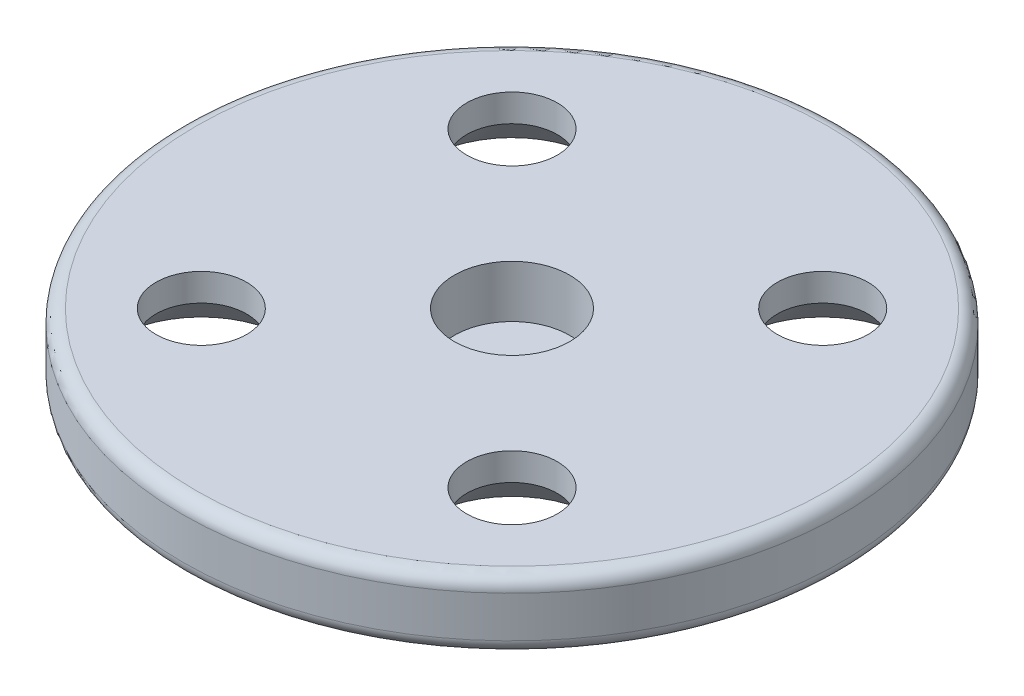
ISO-10303-21;
HEADER;
FILE_DESCRIPTION(('STEP AP214'),'2;1');
FILE_NAME('part.step','',(''),(''),'','','');
FILE_SCHEMA(('AUTOMOTIVE_DESIGN { 1 0 10303 214 1 1 1 1 }'));
ENDSEC;
DATA;
#1=APPLICATION_CONTEXT('core data for automotive mechanical design processes');
#2=APPLICATION_PROTOCOL_DEFINITION('international standard','automotive_design',2000,#1);
#3=PRODUCT_CONTEXT('',#1,'mechanical');
#4=PRODUCT('Part','Part','',(#3));
#5=PRODUCT_RELATED_PRODUCT_CATEGORY('part','',(#4));
#6=PRODUCT_DEFINITION_FORMATION('','',#4);
#7=PRODUCT_DEFINITION_CONTEXT('part definition',#1,'design');
#8=PRODUCT_DEFINITION('design','',#6,#7);
#9=PRODUCT_DEFINITION_SHAPE('','',#8);
#10=(LENGTH_UNIT() NAMED_UNIT(*) SI_UNIT(.MILLI.,.METRE.));
#11=(NAMED_UNIT(*) PLANE_ANGLE_UNIT() SI_UNIT($,.RADIAN.));
#12=(NAMED_UNIT(*) SI_UNIT($,.STERADIAN.) SOLID_ANGLE_UNIT());
#13=UNCERTAINTY_MEASURE_WITH_UNIT(LENGTH_MEASURE(1.E-05),#10,'distance_accuracy_value','');
#14=(GEOMETRIC_REPRESENTATION_CONTEXT(3) GLOBAL_UNCERTAINTY_ASSIGNED_CONTEXT((#13)) GLOBAL_UNIT_ASSIGNED_CONTEXT((#10,
#11,#12)) REPRESENTATION_CONTEXT('',''));
#15=CARTESIAN_POINT('',(0.,0.,0.));
#16=DIRECTION('',(0.,0.,1.));
#17=DIRECTION('',(1.,0.,0.));
#18=AXIS2_PLACEMENT_3D('',#15,#16,#17);
#19=CARTESIAN_POINT('',(0.,2.5,0.));
#20=DIRECTION('',(0.,1.,0.));
#21=DIRECTION('',(0.,0.,1.));
#22=AXIS2_PLACEMENT_3D('',#19,#20,#21);
#23=PLANE('',#22);
#24=CARTESIAN_POINT('',(0.,2.5,0.));
#25=DIRECTION('',(0.,1.,0.));
#26=DIRECTION('',(0.,0.,1.));
#27=AXIS2_PLACEMENT_3D('',#24,#25,#26);
#28=CIRCLE('',#27,11.5);
#29=CARTESIAN_POINT('',(0.,2.5,11.5));
#30=VERTEX_POINT('',#29);
#31=EDGE_CURVE('E10',#30,#30,#28,.T.);
#32=ORIENTED_EDGE('',*,*,#31,.T.);
#33=EDGE_LOOP('',(#32));
#34=FACE_BOUND('',#33,.T.);
#35=CARTESIAN_POINT('',(0.,2.5,0.));
#36=DIRECTION('',(0.,1.,0.));
#37=DIRECTION('',(0.,0.,1.));
#38=AXIS2_PLACEMENT_3D('',#35,#36,#37);
#39=CIRCLE('',#38,2.1);
#40=CARTESIAN_POINT('',(0.,2.5,2.1));
#41=VERTEX_POINT('',#40);
#42=EDGE_CURVE('E115',#41,#41,#39,.T.);
#43=ORIENTED_EDGE('',*,*,#42,.F.);
#44=EDGE_LOOP('',(#43));
#45=FACE_BOUND('',#44,.T.);
#46=CARTESIAN_POINT('',(5.65685424949238,2.5,5.65685424949238));
#47=DIRECTION('',(0.,1.,0.));
#48=DIRECTION('',(0.,0.,1.));
#49=AXIS2_PLACEMENT_3D('',#46,#47,#48);
#50=CIRCLE('',#49,1.65);
#51=CARTESIAN_POINT('',(5.65685424949238,2.5,7.30685424949238));
#52=VERTEX_POINT('',#51);
#53=EDGE_CURVE('E106',#52,#52,#50,.T.);
#54=ORIENTED_EDGE('',*,*,#53,.F.);
#55=EDGE_LOOP('',(#54));
#56=FACE_BOUND('',#55,.T.);
#57=CARTESIAN_POINT('',(-5.65685424949238,2.5,-5.65685424949238));
#58=DIRECTION('',(0.,1.,0.));
#59=DIRECTION('',(0.,0.,1.));
#60=AXIS2_PLACEMENT_3D('',#57,#58,#59);
#61=CIRCLE('',#60,1.65);
#62=CARTESIAN_POINT('',(-5.65685424949238,2.5,-4.00685424949238));
#63=VERTEX_POINT('',#62);
#64=EDGE_CURVE('E98',#63,#63,#61,.T.);
#65=ORIENTED_EDGE('',*,*,#64,.F.);
#66=EDGE_LOOP('',(#65));
#67=FACE_BOUND('',#66,.T.);
#68=CARTESIAN_POINT('',(5.65685424949238,2.5,-5.65685424949238));
#69=DIRECTION('',(0.,1.,0.));
#70=DIRECTION('',(0.,0.,1.));
#71=AXIS2_PLACEMENT_3D('',#68,#69,#70);
#72=CIRCLE('',#71,1.65);
#73=CARTESIAN_POINT('',(5.65685424949238,2.5,-4.00685424949238));
#74=VERTEX_POINT('',#73);
#75=EDGE_CURVE('E102',#74,#74,#72,.T.);
#76=ORIENTED_EDGE('',*,*,#75,.F.);
#77=EDGE_LOOP('',(#76));
#78=FACE_BOUND('',#77,.T.);
#79=CARTESIAN_POINT('',(-5.65685424949238,2.5,5.65685424949238));
#80=DIRECTION('',(0.,1.,0.));
#81=DIRECTION('',(0.,0.,1.));
#82=AXIS2_PLACEMENT_3D('',#79,#80,#81);
#83=CIRCLE('',#82,1.65);
#84=CARTESIAN_POINT('',(-5.65685424949238,2.5,7.30685424949238));
#85=VERTEX_POINT('',#84);
#86=EDGE_CURVE('E110',#85,#85,#83,.T.);
#87=ORIENTED_EDGE('',*,*,#86,.F.);
#88=EDGE_LOOP('',(#87));
#89=FACE_BOUND('',#88,.T.);
#90=ADVANCED_FACE('F42',(#34,#45,#56,#67,#78,#89),#23,.T.);
#91=CARTESIAN_POINT('',(0.,0.,0.));
#92=DIRECTION('',(0.,1.,0.));
#93=DIRECTION('',(0.,0.,1.));
#94=AXIS2_PLACEMENT_3D('',#91,#92,#93);
#95=PLANE('',#94);
#96=CARTESIAN_POINT('',(0.,0.,0.));
#97=DIRECTION('',(0.,1.,0.));
#98=DIRECTION('',(0.,0.,1.));
#99=AXIS2_PLACEMENT_3D('',#96,#97,#98);
#100=CIRCLE('',#99,11.5);
#101=CARTESIAN_POINT('',(0.,0.,11.5));
#102=VERTEX_POINT('',#101);
#103=EDGE_CURVE('E50',#102,#102,#100,.F.);
#104=ORIENTED_EDGE('',*,*,#103,.T.);
#105=EDGE_LOOP('',(#104));
#106=FACE_BOUND('',#105,.T.);
#107=CARTESIAN_POINT('',(5.65685424949238,0.,-5.65685424949238));
#108=DIRECTION('',(0.,1.,0.));
#109=DIRECTION('',(0.,0.,1.));
#110=AXIS2_PLACEMENT_3D('',#107,#108,#109);
#111=CIRCLE('',#110,3.15);
#112=CARTESIAN_POINT('',(5.65685424949238,0.,-2.50685424949238));
#113=VERTEX_POINT('',#112);
#114=EDGE_CURVE('E82',#113,#113,#111,.T.);
#115=ORIENTED_EDGE('',*,*,#114,.T.);
#116=EDGE_LOOP('',(#115));
#117=FACE_BOUND('',#116,.T.);
#118=CARTESIAN_POINT('',(5.65685424949238,0.,5.65685424949238));
#119=DIRECTION('',(0.,1.,0.));
#120=DIRECTION('',(0.,0.,1.));
#121=AXIS2_PLACEMENT_3D('',#118,#119,#120);
#122=CIRCLE('',#121,3.15);
#123=CARTESIAN_POINT('',(5.65685424949238,0.,8.80685424949238));
#124=VERTEX_POINT('',#123);
#125=EDGE_CURVE('E86',#124,#124,#122,.T.);
#126=ORIENTED_EDGE('',*,*,#125,.T.);
#127=EDGE_LOOP('',(#126));
#128=FACE_BOUND('',#127,.T.);
#129=CARTESIAN_POINT('',(-5.65685424949238,0.,-5.65685424949238));
#130=DIRECTION('',(0.,1.,0.));
#131=DIRECTION('',(0.,0.,1.));
#132=AXIS2_PLACEMENT_3D('',#129,#130,#131);
#133=CIRCLE('',#132,3.15);
#134=CARTESIAN_POINT('',(-5.65685424949238,0.,-2.50685424949238));
#135=VERTEX_POINT('',#134);
#136=EDGE_CURVE('E90',#135,#135,#133,.T.);
#137=ORIENTED_EDGE('',*,*,#136,.T.);
#138=EDGE_LOOP('',(#137));
#139=FACE_BOUND('',#138,.T.);
#140=CARTESIAN_POINT('',(-5.65685424949238,0.,5.65685424949238));
#141=DIRECTION('',(0.,1.,0.));
#142=DIRECTION('',(0.,0.,1.));
#143=AXIS2_PLACEMENT_3D('',#140,#141,#142);
#144=CIRCLE('',#143,3.15);
#145=CARTESIAN_POINT('',(-5.65685424949238,0.,8.80685424949238));
#146=VERTEX_POINT('',#145);
#147=EDGE_CURVE('E94',#146,#146,#144,.T.);
#148=ORIENTED_EDGE('',*,*,#147,.T.);
#149=EDGE_LOOP('',(#148));
#150=FACE_BOUND('',#149,.T.);
#151=ADVANCED_FACE('F134',(#106,#117,#128,#139,#150),#95,.F.);
#152=CARTESIAN_POINT('',(0.,2.5,0.));
#153=DIRECTION('',(0.,-1.,0.));
#154=DIRECTION('',(0.,0.,-1.));
#155=AXIS2_PLACEMENT_3D('',#152,#153,#154);
#156=CYLINDRICAL_SURFACE('',#155,12.);
#157=CARTESIAN_POINT('',(0.,0.5,0.));
#158=DIRECTION('',(0.,1.,0.));
#159=DIRECTION('',(0.,0.,1.));
#160=AXIS2_PLACEMENT_3D('',#157,#158,#159);
#161=CIRCLE('',#160,12.);
#162=CARTESIAN_POINT('',(0.,0.5,12.));
#163=VERTEX_POINT('',#162);
#164=EDGE_CURVE('E55',#163,#163,#161,.T.);
#165=ORIENTED_EDGE('',*,*,#164,.T.);
#166=EDGE_LOOP('',(#165));
#167=FACE_BOUND('',#166,.T.);
#168=CARTESIAN_POINT('',(0.,2.,0.));
#169=DIRECTION('',(0.,1.,0.));
#170=DIRECTION('',(0.,0.,1.));
#171=AXIS2_PLACEMENT_3D('',#168,#169,#170);
#172=CIRCLE('',#171,12.);
#173=CARTESIAN_POINT('',(0.,2.,12.));
#174=VERTEX_POINT('',#173);
#175=EDGE_CURVE('E60',#174,#174,#172,.F.);
#176=ORIENTED_EDGE('',*,*,#175,.T.);
#177=EDGE_LOOP('',(#176));
#178=FACE_BOUND('',#177,.T.);
#179=ADVANCED_FACE('F161',(#167,#178),#156,.T.);
#180=CARTESIAN_POINT('',(-5.65685424949238,2.5,-5.65685424949238));
#181=DIRECTION('',(0.,-1.,0.));
#182=DIRECTION('',(0.,0.,-1.));
#183=AXIS2_PLACEMENT_3D('',#180,#181,#182);
#184=CYLINDRICAL_SURFACE('',#183,1.65);
#185=CARTESIAN_POINT('',(-5.65685424949238,1.50000000000001,-5.65685424949238));
#186=DIRECTION('',(0.,1.,0.));
#187=DIRECTION('',(0.,0.,1.));
#188=AXIS2_PLACEMENT_3D('',#185,#186,#187);
#189=CIRCLE('',#188,1.65);
#190=CARTESIAN_POINT('',(-5.65685424949238,1.50000000000001,-4.00685424949238));
#191=VERTEX_POINT('',#190);
#192=EDGE_CURVE('E70',#191,#191,#189,.F.);
#193=ORIENTED_EDGE('',*,*,#192,.T.);
#194=EDGE_LOOP('',(#193));
#195=FACE_BOUND('',#194,.T.);
#196=ORIENTED_EDGE('',*,*,#64,.T.);
#197=EDGE_LOOP('',(#196));
#198=FACE_BOUND('',#197,.T.);
#199=ADVANCED_FACE('F158',(#195,#198),#184,.F.);
#200=CARTESIAN_POINT('',(5.65685424949238,2.5,-5.65685424949238));
#201=DIRECTION('',(0.,-1.,0.));
#202=DIRECTION('',(0.,0.,-1.));
#203=AXIS2_PLACEMENT_3D('',#200,#201,#202);
#204=CYLINDRICAL_SURFACE('',#203,1.65);
#205=CARTESIAN_POINT('',(5.65685424949238,1.50000000000001,-5.65685424949238));
#206=DIRECTION('',(0.,1.,0.));
#207=DIRECTION('',(0.,0.,1.));
#208=AXIS2_PLACEMENT_3D('',#205,#206,#207);
#209=CIRCLE('',#208,1.65);
#210=CARTESIAN_POINT('',(5.65685424949238,1.50000000000001,-4.00685424949238));
#211=VERTEX_POINT('',#210);
#212=EDGE_CURVE('E78',#211,#211,#209,.F.);
#213=ORIENTED_EDGE('',*,*,#212,.T.);
#214=EDGE_LOOP('',(#213));
#215=FACE_BOUND('',#214,.T.);
#216=ORIENTED_EDGE('',*,*,#75,.T.);
#217=EDGE_LOOP('',(#216));
#218=FACE_BOUND('',#217,.T.);
#219=ADVANCED_FACE('F151',(#215,#218),#204,.F.);
#220=CARTESIAN_POINT('',(5.65685424949238,2.5,5.65685424949238));
#221=DIRECTION('',(0.,-1.,0.));
#222=DIRECTION('',(0.,0.,-1.));
#223=AXIS2_PLACEMENT_3D('',#220,#221,#222);
#224=CYLINDRICAL_SURFACE('',#223,1.65);
#225=CARTESIAN_POINT('',(5.65685424949238,1.50000000000001,5.65685424949238));
#226=DIRECTION('',(0.,1.,0.));
#227=DIRECTION('',(0.,0.,1.));
#228=AXIS2_PLACEMENT_3D('',#225,#226,#227);
#229=CIRCLE('',#228,1.65);
#230=CARTESIAN_POINT('',(5.65685424949238,1.50000000000001,7.30685424949238));
#231=VERTEX_POINT('',#230);
#232=EDGE_CURVE('E74',#231,#231,#229,.F.);
#233=ORIENTED_EDGE('',*,*,#232,.T.);
#234=EDGE_LOOP('',(#233));
#235=FACE_BOUND('',#234,.T.);
#236=ORIENTED_EDGE('',*,*,#53,.T.);
#237=EDGE_LOOP('',(#236));
#238=FACE_BOUND('',#237,.T.);
#239=ADVANCED_FACE('F145',(#235,#238),#224,.F.);
#240=CARTESIAN_POINT('',(-5.65685424949238,2.5,5.65685424949238));
#241=DIRECTION('',(0.,-1.,0.));
#242=DIRECTION('',(0.,0.,-1.));
#243=AXIS2_PLACEMENT_3D('',#240,#241,#242);
#244=CYLINDRICAL_SURFACE('',#243,1.65);
#245=CARTESIAN_POINT('',(-5.65685424949238,1.50000000000001,5.65685424949238));
#246=DIRECTION('',(0.,1.,0.));
#247=DIRECTION('',(0.,0.,1.));
#248=AXIS2_PLACEMENT_3D('',#245,#246,#247);
#249=CIRCLE('',#248,1.65);
#250=CARTESIAN_POINT('',(-5.65685424949238,1.50000000000001,7.30685424949238));
#251=VERTEX_POINT('',#250);
#252=EDGE_CURVE('E66',#251,#251,#249,.F.);
#253=ORIENTED_EDGE('',*,*,#252,.T.);
#254=EDGE_LOOP('',(#253));
#255=FACE_BOUND('',#254,.T.);
#256=ORIENTED_EDGE('',*,*,#86,.T.);
#257=EDGE_LOOP('',(#256));
#258=FACE_BOUND('',#257,.T.);
#259=ADVANCED_FACE('F128',(#255,#258),#244,.F.);
#260=CARTESIAN_POINT('',(0.,0.6,0.));
#261=DIRECTION('',(0.,1.,0.));
#262=DIRECTION('',(0.,0.,1.));
#263=AXIS2_PLACEMENT_3D('',#260,#261,#262);
#264=CYLINDRICAL_SURFACE('',#263,2.1);
#265=CARTESIAN_POINT('',(0.,0.6,0.));
#266=DIRECTION('',(0.,1.,0.));
#267=DIRECTION('',(0.,0.,1.));
#268=AXIS2_PLACEMENT_3D('',#265,#266,#267);
#269=CIRCLE('',#268,2.1);
#270=CARTESIAN_POINT('',(0.,0.6,2.1));
#271=VERTEX_POINT('',#270);
#272=EDGE_CURVE('E114',#271,#271,#269,.T.);
#273=CARTESIAN_POINT('',(0.,0.6,2.1));
#274=CARTESIAN_POINT('',(0.,0.619791666666667,2.1));
#275=CARTESIAN_POINT('',(0.,0.639583333333333,2.1));
#276=CARTESIAN_POINT('',(0.,0.679166666666667,2.1));
#277=CARTESIAN_POINT('',(0.,0.698958333333333,2.1));
#278=CARTESIAN_POINT('',(0.,0.738541666666667,2.1));
#279=CARTESIAN_POINT('',(0.,0.758333333333333,2.1));
#280=CARTESIAN_POINT('',(0.,0.797916666666667,2.1));
#281=CARTESIAN_POINT('',(0.,0.817708333333333,2.1));
#282=CARTESIAN_POINT('',(0.,0.857291666666667,2.1));
#283=CARTESIAN_POINT('',(0.,0.877083333333333,2.1));
#284=CARTESIAN_POINT('',(0.,0.916666666666667,2.1));
#285=CARTESIAN_POINT('',(0.,0.936458333333333,2.1));
#286=CARTESIAN_POINT('',(0.,0.976041666666667,2.1));
#287=CARTESIAN_POINT('',(0.,0.995833333333333,2.1));
#288=CARTESIAN_POINT('',(0.,1.03541666666667,2.1));
#289=CARTESIAN_POINT('',(0.,1.05520833333333,2.1));
#290=CARTESIAN_POINT('',(0.,1.09479166666667,2.1));
#291=CARTESIAN_POINT('',(0.,1.11458333333333,2.1));
#292=CARTESIAN_POINT('',(0.,1.15416666666667,2.1));
#293=CARTESIAN_POINT('',(0.,1.17395833333333,2.1));
#294=CARTESIAN_POINT('',(0.,1.21354166666667,2.1));
#295=CARTESIAN_POINT('',(0.,1.23333333333333,2.1));
#296=CARTESIAN_POINT('',(0.,1.27291666666667,2.1));
#297=CARTESIAN_POINT('',(0.,1.29270833333333,2.1));
#298=CARTESIAN_POINT('',(0.,1.33229166666667,2.1));
#299=CARTESIAN_POINT('',(0.,1.35208333333333,2.1));
#300=CARTESIAN_POINT('',(0.,1.39166666666667,2.1));
#301=CARTESIAN_POINT('',(0.,1.41145833333333,2.1));
#302=CARTESIAN_POINT('',(0.,1.45104166666667,2.1));
#303=CARTESIAN_POINT('',(0.,1.47083333333333,2.1));
#304=CARTESIAN_POINT('',(0.,1.51041666666667,2.1));
#305=CARTESIAN_POINT('',(0.,1.53020833333333,2.1));
#306=CARTESIAN_POINT('',(0.,1.56979166666667,2.1));
#307=CARTESIAN_POINT('',(0.,1.58958333333333,2.1));
#308=CARTESIAN_POINT('',(0.,1.62916666666667,2.1));
#309=CARTESIAN_POINT('',(0.,1.64895833333333,2.1));
#310=CARTESIAN_POINT('',(0.,1.68854166666667,2.1));
#311=CARTESIAN_POINT('',(0.,1.70833333333333,2.1));
#312=CARTESIAN_POINT('',(0.,1.74791666666667,2.1));
#313=CARTESIAN_POINT('',(0.,1.76770833333333,2.1));
#314=CARTESIAN_POINT('',(0.,1.80729166666667,2.1));
#315=CARTESIAN_POINT('',(0.,1.82708333333333,2.1));
#316=CARTESIAN_POINT('',(0.,1.86666666666667,2.1));
#317=CARTESIAN_POINT('',(0.,1.88645833333333,2.1));
#318=CARTESIAN_POINT('',(0.,1.92604166666667,2.1));
#319=CARTESIAN_POINT('',(0.,1.94583333333333,2.1));
#320=CARTESIAN_POINT('',(0.,1.98541666666667,2.1));
#321=CARTESIAN_POINT('',(0.,2.00520833333333,2.1));
#322=CARTESIAN_POINT('',(0.,2.04479166666667,2.1));
#323=CARTESIAN_POINT('',(0.,2.06458333333333,2.1));
#324=CARTESIAN_POINT('',(0.,2.10416666666667,2.1));
#325=CARTESIAN_POINT('',(0.,2.12395833333333,2.1));
#326=CARTESIAN_POINT('',(0.,2.16354166666667,2.1));
#327=CARTESIAN_POINT('',(0.,2.18333333333333,2.1));
#328=CARTESIAN_POINT('',(0.,2.22291666666667,2.1));
#329=CARTESIAN_POINT('',(0.,2.24270833333333,2.1));
#330=CARTESIAN_POINT('',(0.,2.28229166666667,2.1));
#331=CARTESIAN_POINT('',(0.,2.30208333333333,2.1));
#332=CARTESIAN_POINT('',(0.,2.34166666666667,2.1));
#333=CARTESIAN_POINT('',(0.,2.36145833333333,2.1));
#334=CARTESIAN_POINT('',(0.,2.40104166666667,2.1));
#335=CARTESIAN_POINT('',(0.,2.42083333333333,2.1));
#336=CARTESIAN_POINT('',(0.,2.46041666666667,2.1));
#337=CARTESIAN_POINT('',(0.,2.48020833333333,2.1));
#338=CARTESIAN_POINT('',(0.,2.5,2.1));
#339=B_SPLINE_CURVE_WITH_KNOTS('',3,(#273,#274,#275,#276,#277,#278,#279,#280,#281,#282,#283,
#284,#285,#286,#287,#288,#289,#290,#291,#292,#293,#294,#295,#296,#297,#298,#299,#300,#301,#302,
#303,#304,#305,#306,#307,#308,#309,#310,#311,#312,#313,#314,#315,#316,#317,#318,#319,#320,#321,
#322,#323,#324,#325,#326,#327,#328,#329,#330,#331,#332,#333,#334,#335,#336,#337,#338),
.UNSPECIFIED.,.F.,.F.,(4,2,2,2,2,2,2,2,2,2,2,2,2,2,2,2,2,2,2,2,2,2,2,2,2,2,2,2,2,2,2,2,4),(0.,
0.0593750000000001,0.11875,0.178125,0.2375,0.296875,0.35625,0.415625,0.475,0.534375,0.59375,
0.653125,0.7125,0.771875,0.83125,0.890625,0.95,1.009375,1.06875,1.128125,1.1875,1.246875,
1.30625,1.365625,1.425,1.484375,1.54375,1.603125,1.6625,1.721875,1.78125,1.840625,1.9),.UNSPECIFIED.);
#340=EDGE_CURVE('BSEAM125',#271,#41,#339,.T.);
#341=ORIENTED_EDGE('',*,*,#272,.F.);
#342=ORIENTED_EDGE('',*,*,#42,.T.);
#343=ORIENTED_EDGE('',*,*,#340,.T.);
#344=ORIENTED_EDGE('',*,*,#340,.F.);
#345=EDGE_LOOP('',(#341,#343,#342,#344));
#346=FACE_BOUND('',#345,.T.);
#347=ADVANCED_FACE('F125',(#346),#264,.F.);
#348=CARTESIAN_POINT('',(0.,0.6,0.));
#349=DIRECTION('',(0.,1.,0.));
#350=DIRECTION('',(0.,0.,1.));
#351=AXIS2_PLACEMENT_3D('',#348,#349,#350);
#352=PLANE('',#351);
#353=ORIENTED_EDGE('',*,*,#272,.T.);
#354=EDGE_LOOP('',(#353));
#355=FACE_BOUND('',#354,.T.);
#356=ADVANCED_FACE('F123',(#355),#352,.T.);
#357=CARTESIAN_POINT('',(5.65685424949238,0.,-5.65685424949238));
#358=DIRECTION('',(0.,-1.,0.));
#359=DIRECTION('',(0.,0.,-1.));
#360=AXIS2_PLACEMENT_3D('',#357,#358,#359);
#361=CONICAL_SURFACE('',#360,3.15,0.785398163397447);
#362=ORIENTED_EDGE('',*,*,#212,.F.);
#363=EDGE_LOOP('',(#362));
#364=FACE_BOUND('',#363,.T.);
#365=ORIENTED_EDGE('',*,*,#114,.F.);
#366=EDGE_LOOP('',(#365));
#367=FACE_BOUND('',#366,.T.);
#368=ADVANCED_FACE('F170',(#364,#367),#361,.F.);
#369=CARTESIAN_POINT('',(5.65685424949238,0.,5.65685424949238));
#370=DIRECTION('',(0.,-1.,0.));
#371=DIRECTION('',(0.,0.,-1.));
#372=AXIS2_PLACEMENT_3D('',#369,#370,#371);
#373=CONICAL_SURFACE('',#372,3.15,0.785398163397447);
#374=ORIENTED_EDGE('',*,*,#232,.F.);
#375=EDGE_LOOP('',(#374));
#376=FACE_BOUND('',#375,.T.);
#377=ORIENTED_EDGE('',*,*,#125,.F.);
#378=EDGE_LOOP('',(#377));
#379=FACE_BOUND('',#378,.T.);
#380=ADVANCED_FACE('F176',(#376,#379),#373,.F.);
#381=CARTESIAN_POINT('',(-5.65685424949238,0.,-5.65685424949238));
#382=DIRECTION('',(0.,-1.,0.));
#383=DIRECTION('',(0.,0.,-1.));
#384=AXIS2_PLACEMENT_3D('',#381,#382,#383);
#385=CONICAL_SURFACE('',#384,3.15,0.785398163397447);
#386=ORIENTED_EDGE('',*,*,#192,.F.);
#387=EDGE_LOOP('',(#386));
#388=FACE_BOUND('',#387,.T.);
#389=ORIENTED_EDGE('',*,*,#136,.F.);
#390=EDGE_LOOP('',(#389));
#391=FACE_BOUND('',#390,.T.);
#392=ADVANCED_FACE('F183',(#388,#391),#385,.F.);
#393=CARTESIAN_POINT('',(-5.65685424949238,0.,5.65685424949238));
#394=DIRECTION('',(0.,-1.,0.));
#395=DIRECTION('',(0.,0.,-1.));
#396=AXIS2_PLACEMENT_3D('',#393,#394,#395);
#397=CONICAL_SURFACE('',#396,3.15,0.785398163397447);
#398=ORIENTED_EDGE('',*,*,#252,.F.);
#399=EDGE_LOOP('',(#398));
#400=FACE_BOUND('',#399,.T.);
#401=ORIENTED_EDGE('',*,*,#147,.F.);
#402=EDGE_LOOP('',(#401));
#403=FACE_BOUND('',#402,.T.);
#404=ADVANCED_FACE('F190',(#400,#403),#397,.F.);
#405=CARTESIAN_POINT('',(0.,0.5,0.));
#406=DIRECTION('',(0.,1.,0.));
#407=DIRECTION('',(0.,0.,1.));
#408=AXIS2_PLACEMENT_3D('',#405,#406,#407);
#409=TOROIDAL_SURFACE('',#408,11.5,0.5);
#410=ORIENTED_EDGE('',*,*,#103,.F.);
#411=EDGE_LOOP('',(#410));
#412=FACE_BOUND('',#411,.T.);
#413=ORIENTED_EDGE('',*,*,#164,.F.);
#414=EDGE_LOOP('',(#413));
#415=FACE_BOUND('',#414,.T.);
#416=ADVANCED_FACE('F195',(#412,#415),#409,.T.);
#417=CARTESIAN_POINT('',(0.,2.,0.));
#418=DIRECTION('',(0.,1.,0.));
#419=DIRECTION('',(0.,0.,1.));
#420=AXIS2_PLACEMENT_3D('',#417,#418,#419);
#421=TOROIDAL_SURFACE('',#420,11.5,0.5);
#422=ORIENTED_EDGE('',*,*,#175,.F.);
#423=EDGE_LOOP('',(#422));
#424=FACE_BOUND('',#423,.T.);
#425=ORIENTED_EDGE('',*,*,#31,.F.);
#426=EDGE_LOOP('',(#425));
#427=FACE_BOUND('',#426,.T.);
#428=ADVANCED_FACE('F44',(#424,#427),#421,.T.);
#429=CLOSED_SHELL('',(#90,#151,#179,#199,#219,#239,#259,#347,#356,#368,#380,#392,#404,#416,#428));
#430=MANIFOLD_SOLID_BREP('B2',#429);
#431=ADVANCED_BREP_SHAPE_REPRESENTATION('',(#18,#430),#14);
#432=SHAPE_DEFINITION_REPRESENTATION(#9,#431);
ENDSEC;
END-ISO-10303-21;
